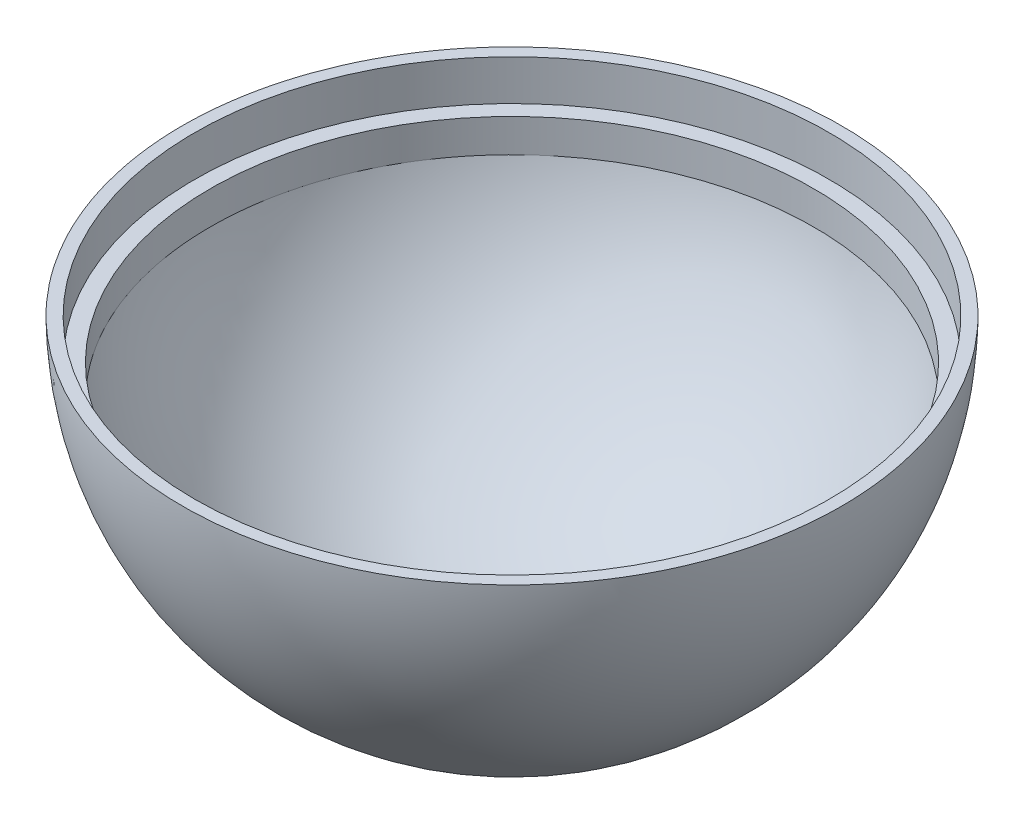
ISO-10303-21;
HEADER;
FILE_DESCRIPTION(('STEP AP214'),'2;1');
FILE_NAME('part.step','',(''),(''),'','','');
FILE_SCHEMA(('AUTOMOTIVE_DESIGN { 1 0 10303 214 1 1 1 1 }'));
ENDSEC;
DATA;
#1=APPLICATION_CONTEXT('core data for automotive mechanical design processes');
#2=APPLICATION_PROTOCOL_DEFINITION('international standard','automotive_design',2000,#1);
#3=PRODUCT_CONTEXT('',#1,'mechanical');
#4=PRODUCT('Part','Part','',(#3));
#5=PRODUCT_RELATED_PRODUCT_CATEGORY('part','',(#4));
#6=PRODUCT_DEFINITION_FORMATION('','',#4);
#7=PRODUCT_DEFINITION_CONTEXT('part definition',#1,'design');
#8=PRODUCT_DEFINITION('design','',#6,#7);
#9=PRODUCT_DEFINITION_SHAPE('','',#8);
#10=(LENGTH_UNIT() NAMED_UNIT(*) SI_UNIT(.MILLI.,.METRE.));
#11=(NAMED_UNIT(*) PLANE_ANGLE_UNIT() SI_UNIT($,.RADIAN.));
#12=(NAMED_UNIT(*) SI_UNIT($,.STERADIAN.) SOLID_ANGLE_UNIT());
#13=UNCERTAINTY_MEASURE_WITH_UNIT(LENGTH_MEASURE(1.E-05),#10,'distance_accuracy_value','');
#14=(GEOMETRIC_REPRESENTATION_CONTEXT(3) GLOBAL_UNCERTAINTY_ASSIGNED_CONTEXT((#13)) GLOBAL_UNIT_ASSIGNED_CONTEXT((#10,
#11,#12)) REPRESENTATION_CONTEXT('',''));
#15=CARTESIAN_POINT('',(0.,0.,0.));
#16=DIRECTION('',(0.,0.,1.));
#17=DIRECTION('',(1.,0.,0.));
#18=AXIS2_PLACEMENT_3D('',#15,#16,#17);
#19=CARTESIAN_POINT('',(0.,-39.011696195372,0.));
#20=DIRECTION('',(0.,1.,0.));
#21=DIRECTION('',(0.,0.,1.));
#22=AXIS2_PLACEMENT_3D('',#19,#20,#21);
#23=PLANE('',#22);
#24=CARTESIAN_POINT('',(0.,-39.011696195372,0.));
#25=DIRECTION('',(0.,1.,0.));
#26=DIRECTION('',(0.,0.,1.));
#27=AXIS2_PLACEMENT_3D('',#24,#25,#26);
#28=CIRCLE('',#27,1.49860000000001);
#29=CARTESIAN_POINT('',(0.,-39.011696195372,1.49860000000001));
#30=VERTEX_POINT('',#29);
#31=EDGE_CURVE('E17',#30,#30,#28,.T.);
#32=ORIENTED_EDGE('',*,*,#31,.T.);
#33=EDGE_LOOP('',(#32));
#34=FACE_BOUND('',#33,.T.);
#35=ADVANCED_FACE('F14',(#34),#23,.T.);
#36=CARTESIAN_POINT('',(0.,40.8756341211974,0.));
#37=DIRECTION('',(0.,1.,0.));
#38=DIRECTION('',(0.,0.,1.));
#39=AXIS2_PLACEMENT_3D('',#36,#37,#38);
#40=CYLINDRICAL_SURFACE('',#39,1.49860000000001);
#41=CARTESIAN_POINT('',(0.,-38.6100720496608,0.));
#42=DIRECTION('',(0.,1.,0.));
#43=DIRECTION('',(0.,0.,1.));
#44=AXIS2_PLACEMENT_3D('',#41,#42,#43);
#45=CIRCLE('',#44,1.49860000000001);
#46=CARTESIAN_POINT('',(0.,-38.6100720496608,1.49860000000001));
#47=VERTEX_POINT('',#46);
#48=EDGE_CURVE('E128',#47,#47,#45,.T.);
#49=ORIENTED_EDGE('',*,*,#48,.T.);
#50=EDGE_LOOP('',(#49));
#51=FACE_BOUND('',#50,.T.);
#52=ORIENTED_EDGE('',*,*,#31,.F.);
#53=EDGE_LOOP('',(#52));
#54=FACE_BOUND('',#53,.T.);
#55=ADVANCED_FACE('F57',(#51,#54),#40,.F.);
#56=CARTESIAN_POINT('',(0.,0.,0.));
#57=DIRECTION('',(1.,0.,0.));
#58=DIRECTION('',(0.,-1.,0.));
#59=AXIS2_PLACEMENT_3D('',#56,#57,#58);
#60=SPHERICAL_SURFACE('',#59,38.6391442146433);
#61=ORIENTED_EDGE('',*,*,#48,.F.);
#62=EDGE_LOOP('',(#61));
#63=FACE_BOUND('',#62,.T.);
#64=CARTESIAN_POINT('',(0.,-9.65200000000001,0.));
#65=DIRECTION('',(0.,1.,0.));
#66=DIRECTION('',(0.,0.,1.));
#67=AXIS2_PLACEMENT_3D('',#64,#65,#66);
#68=CIRCLE('',#67,37.4142);
#69=CARTESIAN_POINT('',(0.,-9.65200000000001,37.4142));
#70=VERTEX_POINT('',#69);
#71=EDGE_CURVE('E131',#70,#70,#68,.T.);
#72=ORIENTED_EDGE('',*,*,#71,.T.);
#73=EDGE_LOOP('',(#72));
#74=FACE_BOUND('',#73,.T.);
#75=ADVANCED_FACE('F54',(#63,#74),#60,.F.);
#76=CARTESIAN_POINT('',(0.,40.8756341211974,0.));
#77=DIRECTION('',(0.,1.,0.));
#78=DIRECTION('',(0.,0.,1.));
#79=AXIS2_PLACEMENT_3D('',#76,#77,#78);
#80=CYLINDRICAL_SURFACE('',#79,37.4142);
#81=ORIENTED_EDGE('',*,*,#71,.F.);
#82=EDGE_LOOP('',(#81));
#83=FACE_BOUND('',#82,.T.);
#84=CARTESIAN_POINT('',(0.,-5.53720000000001,0.));
#85=DIRECTION('',(0.,1.,0.));
#86=DIRECTION('',(0.,0.,1.));
#87=AXIS2_PLACEMENT_3D('',#84,#85,#86);
#88=CIRCLE('',#87,37.4142);
#89=CARTESIAN_POINT('',(0.,-5.53720000000001,37.4142));
#90=VERTEX_POINT('',#89);
#91=EDGE_CURVE('E133',#90,#90,#88,.T.);
#92=ORIENTED_EDGE('',*,*,#91,.T.);
#93=EDGE_LOOP('',(#92));
#94=FACE_BOUND('',#93,.T.);
#95=ADVANCED_FACE('F50',(#83,#94),#80,.F.);
#96=CARTESIAN_POINT('',(0.,-5.53720000000001,0.));
#97=DIRECTION('',(0.,-1.,0.));
#98=DIRECTION('',(0.,0.,-1.));
#99=AXIS2_PLACEMENT_3D('',#96,#97,#98);
#100=PLANE('',#99);
#101=CARTESIAN_POINT('',(0.,-5.53720000000001,0.));
#102=DIRECTION('',(0.,1.,0.));
#103=DIRECTION('',(0.,0.,1.));
#104=AXIS2_PLACEMENT_3D('',#101,#102,#103);
#105=CIRCLE('',#104,39.37);
#106=CARTESIAN_POINT('',(0.,-5.53720000000001,39.37));
#107=VERTEX_POINT('',#106);
#108=EDGE_CURVE('E26',#107,#107,#105,.T.);
#109=ORIENTED_EDGE('',*,*,#108,.T.);
#110=EDGE_LOOP('',(#109));
#111=FACE_BOUND('',#110,.T.);
#112=ORIENTED_EDGE('',*,*,#91,.F.);
#113=EDGE_LOOP('',(#112));
#114=FACE_BOUND('',#113,.T.);
#115=ADVANCED_FACE('F46',(#111,#114),#100,.F.);
#116=CARTESIAN_POINT('',(0.,40.8756341211974,0.));
#117=DIRECTION('',(0.,1.,0.));
#118=DIRECTION('',(0.,0.,1.));
#119=AXIS2_PLACEMENT_3D('',#116,#117,#118);
#120=CYLINDRICAL_SURFACE('',#119,39.37);
#121=CARTESIAN_POINT('',(0.,-0.508000000000008,0.));
#122=DIRECTION('',(0.,1.,0.));
#123=DIRECTION('',(0.,0.,1.));
#124=AXIS2_PLACEMENT_3D('',#121,#122,#123);
#125=CIRCLE('',#124,39.37);
#126=CARTESIAN_POINT('',(0.,-0.508000000000008,39.37));
#127=VERTEX_POINT('',#126);
#128=EDGE_CURVE('E21',#127,#127,#125,.F.);
#129=ORIENTED_EDGE('',*,*,#128,.F.);
#130=EDGE_LOOP('',(#129));
#131=FACE_BOUND('',#130,.T.);
#132=ORIENTED_EDGE('',*,*,#108,.F.);
#133=EDGE_LOOP('',(#132));
#134=FACE_BOUND('',#133,.T.);
#135=ADVANCED_FACE('F42',(#131,#134),#120,.F.);
#136=CARTESIAN_POINT('',(0.,-0.508000000000008,0.));
#137=DIRECTION('',(0.,1.,0.));
#138=DIRECTION('',(0.,0.,1.));
#139=AXIS2_PLACEMENT_3D('',#136,#137,#138);
#140=PLANE('',#139);
#141=ORIENTED_EDGE('',*,*,#128,.T.);
#142=EDGE_LOOP('',(#141));
#143=FACE_BOUND('',#142,.T.);
#144=CARTESIAN_POINT('',(40.8724773020917,-0.508000000000008,0.));
#145=CARTESIAN_POINT('',(40.8724777922335,-0.508000000000008,0.338712910691897));
#146=CARTESIAN_POINT('',(40.8682675309138,-0.508000000000009,0.677413786325361));
#147=CARTESIAN_POINT('',(40.8429877288312,-0.508000000000009,1.69397545581615));
#148=CARTESIAN_POINT('',(40.8092511320265,-0.508000000000009,2.37156997380578));
#149=CARTESIAN_POINT('',(40.7080620235597,-0.508000000000008,3.72476167015584));
#150=CARTESIAN_POINT('',(40.6405822904628,-0.508000000000007,4.40035679219683));
#151=CARTESIAN_POINT('',(40.485090808852,-0.508000000000008,5.64323657247032));
#152=CARTESIAN_POINT('',(40.4018640330318,-0.508000000000008,6.21112367292987));
#153=CARTESIAN_POINT('',(40.211571305499,-0.508000000000009,7.34290326229431));
#154=CARTESIAN_POINT('',(40.1045049088058,-0.508000000000009,7.9067956764333));
#155=CARTESIAN_POINT('',(39.8666717516086,-0.508000000000008,9.02980689948916));
#156=CARTESIAN_POINT('',(39.7358954193764,-0.508000000000008,9.58892368467606));
#157=CARTESIAN_POINT('',(39.45088708777,-0.508000000000009,10.7012483075202));
#158=CARTESIAN_POINT('',(39.2966496481333,-0.508000000000009,11.2544547427347));
#159=CARTESIAN_POINT('',(38.7986596674099,-0.508000000000008,12.905248392315));
#160=CARTESIAN_POINT('',(38.4199491293968,-0.508000000000006,13.9925009345539));
#161=CARTESIAN_POINT('',(37.5721603457008,-0.508000000000011,16.1311924108009));
#162=CARTESIAN_POINT('',(37.1030814225229,-0.508000000000018,17.1826310762415));
#163=CARTESIAN_POINT('',(36.3345375188646,-0.508000000000014,18.7267566528809));
#164=CARTESIAN_POINT('',(36.0675979742845,-0.50800000000001,19.235856645802));
#165=CARTESIAN_POINT('',(35.5125453094614,-0.508000000000007,20.2422472953438));
#166=CARTESIAN_POINT('',(35.2244376688147,-0.508000000000008,20.7395409643683));
#167=CARTESIAN_POINT('',(34.6274702347341,-0.508000000000009,21.721600865283));
#168=CARTESIAN_POINT('',(34.3186077883093,-0.508000000000009,22.206365484635));
#169=CARTESIAN_POINT('',(33.6807205614816,-0.508000000000008,23.1624448065173));
#170=CARTESIAN_POINT('',(33.3516944249047,-0.508000000000008,23.6337586012374));
#171=CARTESIAN_POINT('',(32.3355758766598,-0.508000000000009,25.0257610140732));
#172=CARTESIAN_POINT('',(31.6190166519561,-0.508000000000009,25.9252123629878));
#173=CARTESIAN_POINT('',(30.1127901448952,-0.508000000000008,27.6604352754266));
#174=CARTESIAN_POINT('',(29.3231234590777,-0.508000000000005,28.4962073584571));
#175=CARTESIAN_POINT('',(27.6760284522328,-0.508000000000005,30.0984535296903));
#176=CARTESIAN_POINT('',(26.8185877913012,-0.508000000000007,30.8649149434751));
#177=CARTESIAN_POINT('',(25.0421935098459,-0.50800000000001,32.3228763304327));
#178=CARTESIAN_POINT('',(24.123239759715,-0.50800000000001,33.0143761456543));
#179=CARTESIAN_POINT('',(22.2302656182165,-0.508000000000007,34.3175638414347));
#180=CARTESIAN_POINT('',(21.2562405826211,-0.508000000000005,34.929244976356));
#181=CARTESIAN_POINT('',(19.2601224574041,-0.508000000000012,36.0683742037889));
#182=CARTESIAN_POINT('',(18.2380293874216,-0.508000000000022,36.595822330715));
#183=CARTESIAN_POINT('',(16.153079495848,-0.508000000000022,37.5627188700197));
#184=CARTESIAN_POINT('',(15.0902241664639,-0.508000000000012,38.0021705000786));
#185=CARTESIAN_POINT('',(12.9312710346406,-0.508000000000005,38.7899736940672));
#186=CARTESIAN_POINT('',(11.8351732309686,-0.508000000000007,39.1383252546184));
#187=CARTESIAN_POINT('',(9.61754094671921,-0.508000000000009,39.7414481835174));
#188=CARTESIAN_POINT('',(8.49600676637707,-0.508000000000009,39.996220655805));
#189=CARTESIAN_POINT('',(6.23546259409396,-0.508000000000008,40.4103799048549));
#190=CARTESIAN_POINT('',(5.09645260230275,-0.508000000000008,40.5697666824346));
#191=CARTESIAN_POINT('',(2.8090471477598,-0.508000000000009,40.7920221188314));
#192=CARTESIAN_POINT('',(1.660651625755,-0.508000000000009,40.8548901678289));
#193=CARTESIAN_POINT('',(-0.637353370457786,-0.508000000000008,40.8836592682891));
#194=CARTESIAN_POINT('',(-1.78696284467419,-0.508000000000007,40.8495603190804));
#195=CARTESIAN_POINT('',(-4.07922172395373,-0.508000000000009,40.6846379160661));
#196=CARTESIAN_POINT('',(-5.22187113492051,-0.508000000000012,40.5538145443153));
#197=CARTESIAN_POINT('',(-7.49208731376266,-0.508000000000005,40.1963734666434));
#198=CARTESIAN_POINT('',(-8.61965408183699,-0.507999999999995,39.9697557619859));
#199=CARTESIAN_POINT('',(-10.8516815552305,-0.507999999999995,39.4223388806718));
#200=CARTESIAN_POINT('',(-11.9561424076992,-0.508000000000005,39.1015403039994));
#201=CARTESIAN_POINT('',(-14.134113556078,-0.508000000000012,38.3680417717069));
#202=CARTESIAN_POINT('',(-15.2076238507331,-0.508000000000009,37.9553418123603));
#203=CARTESIAN_POINT('',(-17.316076310324,-0.508000000000008,37.0409683040378));
#204=CARTESIAN_POINT('',(-18.3510179491229,-0.50800000000001,36.5392935418434));
#205=CARTESIAN_POINT('',(-20.3749595701191,-0.508000000000007,35.4505409378884));
#206=CARTESIAN_POINT('',(-21.3639595607535,-0.508000000000002,34.863463111812));
#207=CARTESIAN_POINT('',(-23.2890200953943,-0.508000000000002,33.6080565957965));
#208=CARTESIAN_POINT('',(-24.2250788024522,-0.508000000000007,32.9397250890606));
#209=CARTESIAN_POINT('',(-26.0375657331665,-0.50800000000001,31.5265774846564));
#210=CARTESIAN_POINT('',(-26.9139938932383,-0.508000000000008,30.7817613054338));
#211=CARTESIAN_POINT('',(-28.6009164575795,-0.508000000000009,29.2210080638791));
#212=CARTESIAN_POINT('',(-29.4114162543449,-0.508000000000011,28.4050768296109));
#213=CARTESIAN_POINT('',(-30.9608026317891,-0.508000000000006,26.7078326381857));
#214=CARTESIAN_POINT('',(-31.6996895641218,-0.507999999999998,25.8265200021205));
#215=CARTESIAN_POINT('',(-33.1004589486013,-0.507999999999998,24.0049796334935));
#216=CARTESIAN_POINT('',(-33.7623546079492,-0.508000000000006,23.0647620482794));
#217=CARTESIAN_POINT('',(-35.0046816679702,-0.508000000000011,21.1317573287888));
#218=CARTESIAN_POINT('',(-35.5851114646666,-0.508000000000009,20.1389691599829));
#219=CARTESIAN_POINT('',(-36.3915023495686,-0.508000000000008,18.6158165707254));
#220=CARTESIAN_POINT('',(-36.649668791152,-0.508000000000008,18.1022531437827));
#221=CARTESIAN_POINT('',(-37.1441201457544,-0.508000000000009,17.0646960783346));
#222=CARTESIAN_POINT('',(-37.3804063868713,-0.508000000000009,16.5407030752387));
#223=CARTESIAN_POINT('',(-37.83063252696,-0.508000000000008,15.4833071162867));
#224=CARTESIAN_POINT('',(-38.0445760898691,-0.508000000000008,14.9499057201194));
#225=CARTESIAN_POINT('',(-38.4498256800462,-0.508000000000009,13.874460728351));
#226=CARTESIAN_POINT('',(-38.6411264323025,-0.508000000000011,13.3324151521909));
#227=CARTESIAN_POINT('',(-39.160340424828,-0.508000000000013,11.7560144437185));
#228=CARTESIAN_POINT('',(-39.4587708358679,-0.50800000000001,10.7117893914929));
#229=CARTESIAN_POINT('',(-39.9715721101773,-0.508000000000007,8.60292579450663));
#230=CARTESIAN_POINT('',(-40.1859456717723,-0.508000000000008,7.53828790617331));
#231=CARTESIAN_POINT('',(-40.4432818489231,-0.508000000000009,5.93242916694871));
#232=CARTESIAN_POINT('',(-40.5183155442175,-0.508000000000008,5.39617432650052));
#233=CARTESIAN_POINT('',(-40.6470137720042,-0.508000000000009,4.32117717859877));
#234=CARTESIAN_POINT('',(-40.7006823168174,-0.508000000000009,3.78243535743625));
#235=CARTESIAN_POINT('',(-40.7865583344685,-0.508000000000008,2.70348896345232));
#236=CARTESIAN_POINT('',(-40.8187750021802,-0.508000000000007,2.16328511711779));
#237=CARTESIAN_POINT('',(-40.8617333384586,-0.50800000000001,1.0820439050572));
#238=CARTESIAN_POINT('',(-40.8724765192164,-0.508000000000015,0.541006600709875));
#239=CARTESIAN_POINT('',(-40.8724777922335,-0.508000000000013,-0.338712910691901));
#240=CARTESIAN_POINT('',(-40.8682675309138,-0.50800000000001,-0.677413786325365));
#241=CARTESIAN_POINT('',(-40.8429877288312,-0.508000000000006,-1.69397545581615));
#242=CARTESIAN_POINT('',(-40.8092511320265,-0.508000000000008,-2.37156997380579));
#243=CARTESIAN_POINT('',(-40.7080620235597,-0.508000000000009,-3.72476167015585));
#244=CARTESIAN_POINT('',(-40.6405822904628,-0.508000000000009,-4.40035679219685));
#245=CARTESIAN_POINT('',(-40.485090808852,-0.508000000000008,-5.64323657247034));
#246=CARTESIAN_POINT('',(-40.4018640330318,-0.508000000000008,-6.21112367292988));
#247=CARTESIAN_POINT('',(-40.211571305499,-0.508000000000008,-7.34290326229432));
#248=CARTESIAN_POINT('',(-40.1045049088058,-0.508000000000008,-7.90679567643331));
#249=CARTESIAN_POINT('',(-39.8666717516086,-0.508000000000008,-9.02980689948917));
#250=CARTESIAN_POINT('',(-39.7358954193764,-0.508000000000008,-9.58892368467608));
#251=CARTESIAN_POINT('',(-39.45088708777,-0.508000000000008,-10.7012483075202));
#252=CARTESIAN_POINT('',(-39.2966496481333,-0.508000000000009,-11.2544547427347));
#253=CARTESIAN_POINT('',(-38.7986596674098,-0.508000000000008,-12.905248392315));
#254=CARTESIAN_POINT('',(-38.4199491293968,-0.508000000000007,-13.9925009345539));
#255=CARTESIAN_POINT('',(-37.5721603457008,-0.50800000000001,-16.1311924108009));
#256=CARTESIAN_POINT('',(-37.1030814225229,-0.508000000000013,-17.1826310762416));
#257=CARTESIAN_POINT('',(-36.3345375188646,-0.508000000000011,-18.7267566528809));
#258=CARTESIAN_POINT('',(-36.0675979742845,-0.508000000000009,-19.235856645802));
#259=CARTESIAN_POINT('',(-35.5125453094614,-0.508000000000008,-20.2422472953438));
#260=CARTESIAN_POINT('',(-35.2244376688147,-0.508000000000008,-20.7395409643683));
#261=CARTESIAN_POINT('',(-34.6274702347341,-0.508000000000009,-21.721600865283));
#262=CARTESIAN_POINT('',(-34.3186077883093,-0.508000000000009,-22.206365484635));
#263=CARTESIAN_POINT('',(-33.6807205614816,-0.508000000000008,-23.1624448065173));
#264=CARTESIAN_POINT('',(-33.3516944249047,-0.508000000000008,-23.6337586012374));
#265=CARTESIAN_POINT('',(-32.3355758766598,-0.508000000000009,-25.0257610140732));
#266=CARTESIAN_POINT('',(-31.6190166519561,-0.508000000000009,-25.9252123629878));
#267=CARTESIAN_POINT('',(-30.1127901448952,-0.508000000000008,-27.6604352754266));
#268=CARTESIAN_POINT('',(-29.3231234590777,-0.508000000000005,-28.4962073584571));
#269=CARTESIAN_POINT('',(-27.6760284522328,-0.508000000000005,-30.0984535296903));
#270=CARTESIAN_POINT('',(-26.8185877913012,-0.508000000000007,-30.8649149434751));
#271=CARTESIAN_POINT('',(-25.0421935098459,-0.508000000000009,-32.3228763304327));
#272=CARTESIAN_POINT('',(-24.123239759715,-0.508000000000009,-33.0143761456543));
#273=CARTESIAN_POINT('',(-22.2302656182165,-0.508000000000008,-34.3175638414347));
#274=CARTESIAN_POINT('',(-21.2562405826211,-0.508000000000008,-34.929244976356));
#275=CARTESIAN_POINT('',(-19.2601224574041,-0.508000000000009,-36.0683742037889));
#276=CARTESIAN_POINT('',(-18.2380293874216,-0.508000000000008,-36.595822330715));
#277=CARTESIAN_POINT('',(-16.153079495848,-0.508000000000008,-37.5627188700197));
#278=CARTESIAN_POINT('',(-15.0902241664639,-0.508000000000008,-38.0021705000786));
#279=CARTESIAN_POINT('',(-12.9312710346405,-0.508000000000008,-38.7899736940672));
#280=CARTESIAN_POINT('',(-11.8351732309685,-0.508000000000008,-39.1383252546184));
#281=CARTESIAN_POINT('',(-9.6175409467192,-0.508000000000008,-39.7414481835174));
#282=CARTESIAN_POINT('',(-8.49600676637706,-0.508000000000008,-39.996220655805));
#283=CARTESIAN_POINT('',(-6.23546259409396,-0.508000000000008,-40.4103799048549));
#284=CARTESIAN_POINT('',(-5.09645260230274,-0.508000000000008,-40.5697666824346));
#285=CARTESIAN_POINT('',(-2.8090471477598,-0.508000000000008,-40.7920221188314));
#286=CARTESIAN_POINT('',(-1.660651625755,-0.508000000000008,-40.8548901678289));
#287=CARTESIAN_POINT('',(0.637353370457788,-0.508000000000008,-40.8836592682891));
#288=CARTESIAN_POINT('',(1.78696284467418,-0.508000000000008,-40.8495603190804));
#289=CARTESIAN_POINT('',(4.07922172395373,-0.508000000000008,-40.6846379160661));
#290=CARTESIAN_POINT('',(5.22187113492051,-0.508000000000008,-40.5538145443153));
#291=CARTESIAN_POINT('',(7.49208731376266,-0.508000000000008,-40.1963734666434));
#292=CARTESIAN_POINT('',(8.61965408183699,-0.508000000000008,-39.9697557619859));
#293=CARTESIAN_POINT('',(10.8516815552305,-0.508000000000008,-39.4223388806718));
#294=CARTESIAN_POINT('',(11.9561424076992,-0.508000000000008,-39.1015403039994));
#295=CARTESIAN_POINT('',(14.134113556078,-0.508000000000009,-38.3680417717069));
#296=CARTESIAN_POINT('',(15.2076238507331,-0.508000000000009,-37.9553418123603));
#297=CARTESIAN_POINT('',(17.316076310324,-0.508000000000008,-37.0409683040378));
#298=CARTESIAN_POINT('',(18.3510179491229,-0.508000000000007,-36.5392935418434));
#299=CARTESIAN_POINT('',(20.374959570119,-0.50800000000001,-35.4505409378884));
#300=CARTESIAN_POINT('',(21.3639595607535,-0.508000000000015,-34.863463111812));
#301=CARTESIAN_POINT('',(23.2890200953943,-0.508000000000015,-33.6080565957965));
#302=CARTESIAN_POINT('',(24.2250788024522,-0.50800000000001,-32.9397250890606));
#303=CARTESIAN_POINT('',(26.0375657331665,-0.508000000000007,-31.5265774846564));
#304=CARTESIAN_POINT('',(26.9139938932383,-0.508000000000008,-30.7817613054338));
#305=CARTESIAN_POINT('',(28.6009164575795,-0.508000000000009,-29.2210080638791));
#306=CARTESIAN_POINT('',(29.4114162543449,-0.508000000000009,-28.4050768296109));
#307=CARTESIAN_POINT('',(30.9608026317892,-0.508000000000008,-26.7078326381857));
#308=CARTESIAN_POINT('',(31.6996895641219,-0.508000000000008,-25.8265200021205));
#309=CARTESIAN_POINT('',(33.1004589486013,-0.508000000000008,-24.0049796334935));
#310=CARTESIAN_POINT('',(33.7623546079492,-0.508000000000008,-23.0647620482794));
#311=CARTESIAN_POINT('',(35.0046816679702,-0.508000000000008,-21.1317573287888));
#312=CARTESIAN_POINT('',(35.5851114646666,-0.508000000000008,-20.1389691599829));
#313=CARTESIAN_POINT('',(36.3915023495686,-0.508000000000008,-18.6158165707254));
#314=CARTESIAN_POINT('',(36.649668791152,-0.508000000000008,-18.1022531437827));
#315=CARTESIAN_POINT('',(37.1441201457544,-0.508000000000008,-17.0646960783346));
#316=CARTESIAN_POINT('',(37.3804063868713,-0.508000000000008,-16.5407030752387));
#317=CARTESIAN_POINT('',(37.83063252696,-0.508000000000008,-15.4833071162867));
#318=CARTESIAN_POINT('',(38.0445760898691,-0.508000000000008,-14.9499057201194));
#319=CARTESIAN_POINT('',(38.4498256800462,-0.508000000000008,-13.8744607283509));
#320=CARTESIAN_POINT('',(38.6411264323025,-0.508000000000008,-13.3324151521909));
#321=CARTESIAN_POINT('',(39.160340424828,-0.508000000000008,-11.7560144437185));
#322=CARTESIAN_POINT('',(39.4587708358679,-0.508000000000008,-10.7117893914929));
#323=CARTESIAN_POINT('',(39.9715721101773,-0.508000000000008,-8.60292579450664));
#324=CARTESIAN_POINT('',(40.1859456717723,-0.508000000000008,-7.53828790617331));
#325=CARTESIAN_POINT('',(40.4432818489231,-0.508000000000008,-5.93242916694872));
#326=CARTESIAN_POINT('',(40.5183155442175,-0.508000000000008,-5.39617432650052));
#327=CARTESIAN_POINT('',(40.6470137720042,-0.508000000000008,-4.32117717859877));
#328=CARTESIAN_POINT('',(40.7006823168174,-0.508000000000008,-3.78243535743625));
#329=CARTESIAN_POINT('',(40.7865583344685,-0.508000000000008,-2.70348896345233));
#330=CARTESIAN_POINT('',(40.8187750021802,-0.508000000000009,-2.1632851171178));
#331=CARTESIAN_POINT('',(40.8617333384586,-0.508000000000008,-1.0820439050572));
#332=CARTESIAN_POINT('',(40.8724765192164,-0.508000000000008,-0.541006600709879));
#333=CARTESIAN_POINT('',(40.8724773020917,-0.508000000000008,0.));
#334=B_SPLINE_CURVE_WITH_KNOTS('',3,(#144,#145,#146,#147,#148,#149,#150,#151,#152,#153,#154,
#155,#156,#157,#158,#159,#160,#161,#162,#163,#164,#165,#166,#167,#168,#169,#170,#171,#172,#173,
#174,#175,#176,#177,#178,#179,#180,#181,#182,#183,#184,#185,#186,#187,#188,#189,#190,#191,#192,
#193,#194,#195,#196,#197,#198,#199,#200,#201,#202,#203,#204,#205,#206,#207,#208,#209,#210,#211,
#212,#213,#214,#215,#216,#217,#218,#219,#220,#221,#222,#223,#224,#225,#226,#227,#228,#229,#230,
#231,#232,#233,#234,#235,#236,#237,#238,#239,#240,#241,#242,#243,#244,#245,#246,#247,#248,#249,
#250,#251,#252,#253,#254,#255,#256,#257,#258,#259,#260,#261,#262,#263,#264,#265,#266,#267,#268,
#269,#270,#271,#272,#273,#274,#275,#276,#277,#278,#279,#280,#281,#282,#283,#284,#285,#286,#287,
#288,#289,#290,#291,#292,#293,#294,#295,#296,#297,#298,#299,#300,#301,#302,#303,#304,#305,#306,
#307,#308,#309,#310,#311,#312,#313,#314,#315,#316,#317,#318,#319,#320,#321,#322,#323,#324,#325,
#326,#327,#328,#329,#330,#331,#332,#333),.UNSPECIFIED.,.T.,.F.,(4,2,2,2,2,2,2,2,2,2,2,2,2,2,2,2,
2,2,2,2,2,2,2,2,2,2,2,2,2,2,2,2,2,2,2,2,2,2,2,2,2,2,2,2,2,2,2,2,2,2,2,2,2,2,2,2,2,2,2,2,2,2,2,2,
2,2,2,2,2,2,2,2,2,2,2,2,2,2,2,2,2,2,2,2,2,2,2,2,2,2,2,2,2,2,4),(0.,1.0161046578886,
3.05048822770971,5.08651563994947,6.80787753021763,8.52927155340772,10.2513620590199,
11.9738525008638,15.4234459904906,18.8730653428438,20.597153268266,22.3207964562409,
24.0446603902192,25.7686403957485,29.2141445273763,32.6596205469817,36.1057253509789,
39.5518374160961,42.9982405307218,46.4446422372717,49.8909178996555,53.3371936898428,
56.7834288234791,60.2296639275832,63.6759208054148,67.1221777071119,70.5684316852342,
74.0146856178954,77.4609175964856,80.9071497148193,84.3534288279678,87.7997073082068,
91.2461052936198,94.6925069538998,98.1386264376852,101.584728998497,105.030239535058,
108.475817900559,110.199804374725,111.923686136604,113.647284756691,115.37128413011,
118.62573363999,121.880078669592,123.504159937396,125.127936062829,126.751015743655,
128.37398112105,129.390085778939,131.42446934876,133.460496761,135.181858651268,
136.903252674458,138.62534318007,140.347833621914,143.797427111541,147.247046463894,
148.971134389316,150.694777577291,152.418641511269,154.142621516799,157.588125648427,
161.033601668032,164.479706472029,167.925818537146,171.372221651772,174.818623358322,
178.264899020706,181.711174810893,185.157409944529,188.603645048633,192.049901926465,
195.496158828162,198.942412806284,202.388666738946,205.834898717536,209.281130835869,
212.727409949018,216.173688429257,219.62008641467,223.06648807495,226.512607558735,
229.958710119548,233.404220656108,236.849799021609,238.573785495775,240.297667257655,
242.021265877741,243.74526525116,246.99971476104,250.254059790642,251.878141058446,
253.501917183879,255.124996864705,256.7479622421),.UNSPECIFIED.);
#335=CARTESIAN_POINT('',(40.8724773020917,-0.508000000000008,0.));
#336=VERTEX_POINT('',#335);
#337=EDGE_CURVE('E9',#336,#336,#334,.T.);
#338=ORIENTED_EDGE('',*,*,#337,.F.);
#339=EDGE_LOOP('',(#338));
#340=FACE_BOUND('',#339,.T.);
#341=ADVANCED_FACE('F38',(#143,#340),#140,.T.);
#342=CARTESIAN_POINT('',(0.,0.,0.));
#343=DIRECTION('',(1.,0.,0.));
#344=DIRECTION('',(0.,-1.,0.));
#345=AXIS2_PLACEMENT_3D('',#342,#343,#344);
#346=SPHERICAL_SURFACE('',#345,40.8756341211974);
#347=ORIENTED_EDGE('',*,*,#337,.T.);
#348=EDGE_LOOP('',(#347));
#349=FACE_BOUND('',#348,.T.);
#350=ADVANCED_FACE('F36',(#349),#346,.T.);
#351=CLOSED_SHELL('',(#35,#55,#75,#95,#115,#135,#341,#350));
#352=MANIFOLD_SOLID_BREP('B1',#351);
#353=ADVANCED_BREP_SHAPE_REPRESENTATION('',(#18,#352),#14);
#354=SHAPE_DEFINITION_REPRESENTATION(#9,#353);
ENDSEC;
END-ISO-10303-21;
